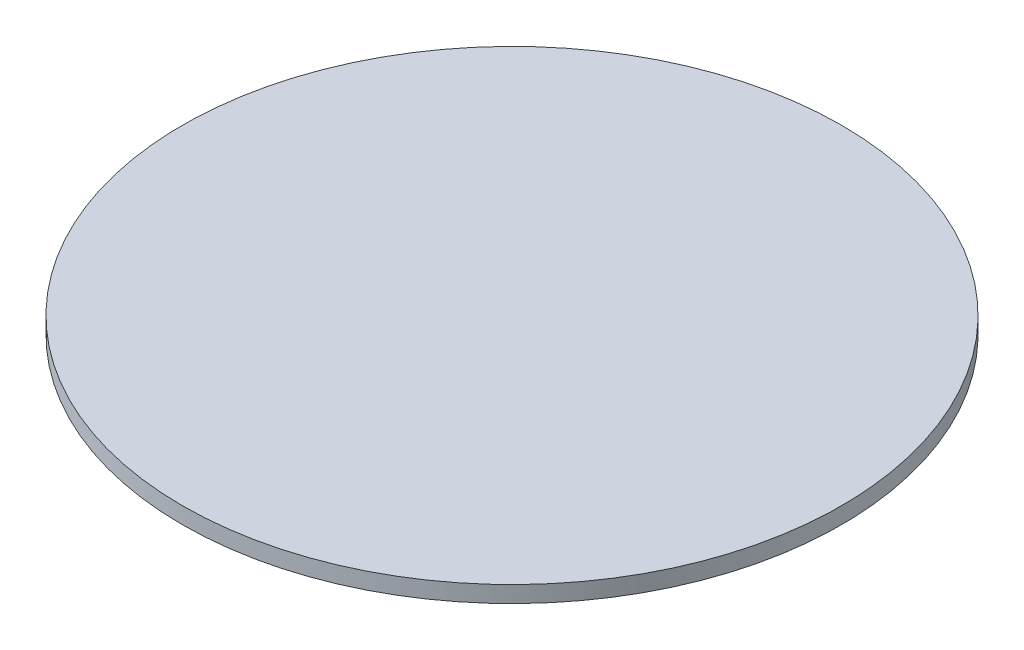
ISO-10303-21;
HEADER;
FILE_DESCRIPTION(('STEP AP214'),'2;1');
FILE_NAME('part.step','',(''),(''),'','','');
FILE_SCHEMA(('AUTOMOTIVE_DESIGN { 1 0 10303 214 1 1 1 1 }'));
ENDSEC;
DATA;
#1=APPLICATION_CONTEXT('core data for automotive mechanical design processes');
#2=APPLICATION_PROTOCOL_DEFINITION('international standard','automotive_design',2000,#1);
#3=PRODUCT_CONTEXT('',#1,'mechanical');
#4=PRODUCT('Part','Part','',(#3));
#5=PRODUCT_RELATED_PRODUCT_CATEGORY('part','',(#4));
#6=PRODUCT_DEFINITION_FORMATION('','',#4);
#7=PRODUCT_DEFINITION_CONTEXT('part definition',#1,'design');
#8=PRODUCT_DEFINITION('design','',#6,#7);
#9=PRODUCT_DEFINITION_SHAPE('','',#8);
#10=(LENGTH_UNIT() NAMED_UNIT(*) SI_UNIT(.MILLI.,.METRE.));
#11=(NAMED_UNIT(*) PLANE_ANGLE_UNIT() SI_UNIT($,.RADIAN.));
#12=(NAMED_UNIT(*) SI_UNIT($,.STERADIAN.) SOLID_ANGLE_UNIT());
#13=UNCERTAINTY_MEASURE_WITH_UNIT(LENGTH_MEASURE(1.E-05),#10,'distance_accuracy_value','');
#14=(GEOMETRIC_REPRESENTATION_CONTEXT(3) GLOBAL_UNCERTAINTY_ASSIGNED_CONTEXT((#13)) GLOBAL_UNIT_ASSIGNED_CONTEXT((#10,
#11,#12)) REPRESENTATION_CONTEXT('',''));
#15=CARTESIAN_POINT('',(0.,0.,0.));
#16=DIRECTION('',(0.,0.,1.));
#17=DIRECTION('',(1.,0.,0.));
#18=AXIS2_PLACEMENT_3D('',#15,#16,#17);
#19=CARTESIAN_POINT('',(0.,5.,0.));
#20=DIRECTION('',(0.,-1.,0.));
#21=DIRECTION('',(0.,0.,-1.));
#22=AXIS2_PLACEMENT_3D('',#19,#20,#21);
#23=CYLINDRICAL_SURFACE('',#22,100.);
#24=CARTESIAN_POINT('',(0.,5.,0.));
#25=DIRECTION('',(0.,1.,0.));
#26=DIRECTION('',(0.,0.,1.));
#27=AXIS2_PLACEMENT_3D('',#24,#25,#26);
#28=CIRCLE('',#27,100.);
#29=CARTESIAN_POINT('',(0.,5.,100.));
#30=VERTEX_POINT('',#29);
#31=EDGE_CURVE('E10',#30,#30,#28,.T.);
#32=ORIENTED_EDGE('',*,*,#31,.F.);
#33=EDGE_LOOP('',(#32));
#34=FACE_BOUND('',#33,.T.);
#35=CARTESIAN_POINT('',(0.,0.,0.));
#36=DIRECTION('',(0.,1.,0.));
#37=DIRECTION('',(0.,0.,1.));
#38=AXIS2_PLACEMENT_3D('',#35,#36,#37);
#39=CIRCLE('',#38,100.);
#40=CARTESIAN_POINT('',(0.,0.,100.));
#41=VERTEX_POINT('',#40);
#42=EDGE_CURVE('E34',#41,#41,#39,.T.);
#43=ORIENTED_EDGE('',*,*,#42,.T.);
#44=EDGE_LOOP('',(#43));
#45=FACE_BOUND('',#44,.T.);
#46=ADVANCED_FACE('F31',(#34,#45),#23,.T.);
#47=CARTESIAN_POINT('',(0.,5.,0.));
#48=DIRECTION('',(0.,1.,0.));
#49=DIRECTION('',(0.,0.,1.));
#50=AXIS2_PLACEMENT_3D('',#47,#48,#49);
#51=PLANE('',#50);
#52=ORIENTED_EDGE('',*,*,#31,.T.);
#53=EDGE_LOOP('',(#52));
#54=FACE_BOUND('',#53,.T.);
#55=ADVANCED_FACE('F46',(#54),#51,.T.);
#56=CARTESIAN_POINT('',(0.,0.,0.));
#57=DIRECTION('',(0.,1.,0.));
#58=DIRECTION('',(0.,0.,1.));
#59=AXIS2_PLACEMENT_3D('',#56,#57,#58);
#60=PLANE('',#59);
#61=ORIENTED_EDGE('',*,*,#42,.F.);
#62=EDGE_LOOP('',(#61));
#63=FACE_BOUND('',#62,.T.);
#64=ADVANCED_FACE('F44',(#63),#60,.F.);
#65=CLOSED_SHELL('',(#46,#55,#64));
#66=MANIFOLD_SOLID_BREP('B2',#65);
#67=ADVANCED_BREP_SHAPE_REPRESENTATION('',(#18,#66),#14);
#68=SHAPE_DEFINITION_REPRESENTATION(#9,#67);
ENDSEC;
END-ISO-10303-21;
